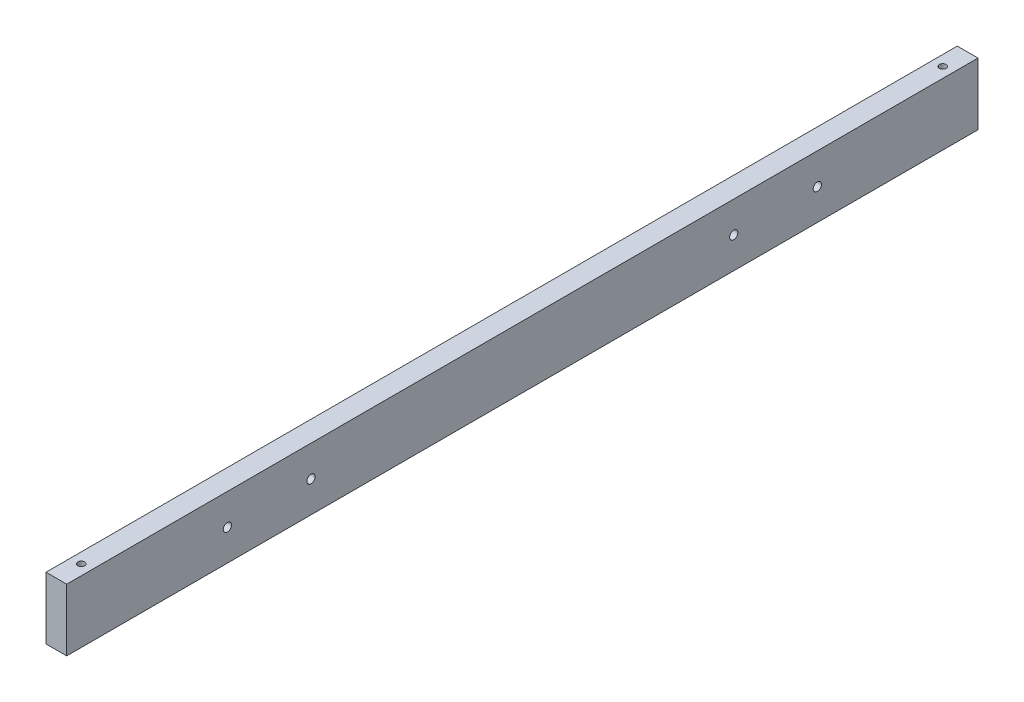
ISO-10303-21;
HEADER;
FILE_DESCRIPTION(('STEP AP214'),'2;1');
FILE_NAME('part.step','',(''),(''),'','','');
FILE_SCHEMA(('AUTOMOTIVE_DESIGN { 1 0 10303 214 1 1 1 1 }'));
ENDSEC;
DATA;
#1=APPLICATION_CONTEXT('core data for automotive mechanical design processes');
#2=APPLICATION_PROTOCOL_DEFINITION('international standard','automotive_design',2000,#1);
#3=PRODUCT_CONTEXT('',#1,'mechanical');
#4=PRODUCT('Part','Part','',(#3));
#5=PRODUCT_RELATED_PRODUCT_CATEGORY('part','',(#4));
#6=PRODUCT_DEFINITION_FORMATION('','',#4);
#7=PRODUCT_DEFINITION_CONTEXT('part definition',#1,'design');
#8=PRODUCT_DEFINITION('design','',#6,#7);
#9=PRODUCT_DEFINITION_SHAPE('','',#8);
#10=(LENGTH_UNIT() NAMED_UNIT(*) SI_UNIT(.MILLI.,.METRE.));
#11=(NAMED_UNIT(*) PLANE_ANGLE_UNIT() SI_UNIT($,.RADIAN.));
#12=(NAMED_UNIT(*) SI_UNIT($,.STERADIAN.) SOLID_ANGLE_UNIT());
#13=UNCERTAINTY_MEASURE_WITH_UNIT(LENGTH_MEASURE(1.E-05),#10,'distance_accuracy_value','');
#14=(GEOMETRIC_REPRESENTATION_CONTEXT(3) GLOBAL_UNCERTAINTY_ASSIGNED_CONTEXT((#13)) GLOBAL_UNIT_ASSIGNED_CONTEXT((#10,
#11,#12)) REPRESENTATION_CONTEXT('',''));
#15=CARTESIAN_POINT('',(0.,0.,0.));
#16=DIRECTION('',(0.,0.,1.));
#17=DIRECTION('',(1.,0.,0.));
#18=AXIS2_PLACEMENT_3D('',#15,#16,#17);
#19=CARTESIAN_POINT('',(0.,0.,440.));
#20=DIRECTION('',(1.,0.,0.));
#21=DIRECTION('',(0.,0.,-1.));
#22=AXIS2_PLACEMENT_3D('',#19,#20,#21);
#23=PLANE('',#22);
#24=CARTESIAN_POINT('',(0.,15.,362.425));
#25=DIRECTION('',(1.,0.,0.));
#26=DIRECTION('',(0.,0.,-1.));
#27=AXIS2_PLACEMENT_3D('',#24,#25,#26);
#28=CIRCLE('',#27,2.);
#29=CARTESIAN_POINT('',(0.,15.,360.425));
#30=VERTEX_POINT('',#29);
#31=EDGE_CURVE('E114',#30,#30,#28,.T.);
#32=ORIENTED_EDGE('',*,*,#31,.T.);
#33=EDGE_LOOP('',(#32));
#34=FACE_BOUND('',#33,.T.);
#35=CARTESIAN_POINT('',(0.,15.,117.96));
#36=DIRECTION('',(1.,0.,0.));
#37=DIRECTION('',(0.,0.,-1.));
#38=AXIS2_PLACEMENT_3D('',#35,#36,#37);
#39=CIRCLE('',#38,2.);
#40=CARTESIAN_POINT('',(0.,15.,115.96));
#41=VERTEX_POINT('',#40);
#42=EDGE_CURVE('E126',#41,#41,#39,.T.);
#43=ORIENTED_EDGE('',*,*,#42,.T.);
#44=EDGE_LOOP('',(#43));
#45=FACE_BOUND('',#44,.T.);
#46=CARTESIAN_POINT('',(0.,15.,322.04));
#47=DIRECTION('',(1.,0.,0.));
#48=DIRECTION('',(0.,0.,-1.));
#49=AXIS2_PLACEMENT_3D('',#46,#47,#48);
#50=CIRCLE('',#49,2.);
#51=CARTESIAN_POINT('',(0.,15.,320.04));
#52=VERTEX_POINT('',#51);
#53=EDGE_CURVE('E125',#52,#52,#50,.T.);
#54=ORIENTED_EDGE('',*,*,#53,.T.);
#55=EDGE_LOOP('',(#54));
#56=FACE_BOUND('',#55,.T.);
#57=CARTESIAN_POINT('',(0.,15.,77.575));
#58=DIRECTION('',(1.,0.,0.));
#59=DIRECTION('',(0.,0.,-1.));
#60=AXIS2_PLACEMENT_3D('',#57,#58,#59);
#61=CIRCLE('',#60,2.);
#62=CARTESIAN_POINT('',(0.,15.,75.575));
#63=VERTEX_POINT('',#62);
#64=EDGE_CURVE('E132',#63,#63,#61,.T.);
#65=ORIENTED_EDGE('',*,*,#64,.T.);
#66=EDGE_LOOP('',(#65));
#67=FACE_BOUND('',#66,.T.);
#68=DIRECTION('',(0.,-1.,0.));
#69=VECTOR('',#68,1.);
#70=CARTESIAN_POINT('',(0.,0.,0.));
#71=LINE('',#70,#69);
#72=CARTESIAN_POINT('',(0.,30.,0.));
#73=VERTEX_POINT('',#72);
#74=CARTESIAN_POINT('',(0.,0.,0.));
#75=VERTEX_POINT('',#74);
#76=EDGE_CURVE('E96',#73,#75,#71,.T.);
#77=ORIENTED_EDGE('',*,*,#76,.T.);
#78=DIRECTION('',(0.,0.,-1.));
#79=VECTOR('',#78,1.);
#80=CARTESIAN_POINT('',(0.,0.,440.));
#81=LINE('',#80,#79);
#82=CARTESIAN_POINT('',(0.,0.,440.));
#83=VERTEX_POINT('',#82);
#84=EDGE_CURVE('E11',#83,#75,#81,.T.);
#85=ORIENTED_EDGE('',*,*,#84,.F.);
#86=DIRECTION('',(0.,-1.,0.));
#87=VECTOR('',#86,1.);
#88=CARTESIAN_POINT('',(0.,0.,440.));
#89=LINE('',#88,#87);
#90=CARTESIAN_POINT('',(0.,30.,440.));
#91=VERTEX_POINT('',#90);
#92=EDGE_CURVE('E84',#91,#83,#89,.T.);
#93=ORIENTED_EDGE('',*,*,#92,.F.);
#94=DIRECTION('',(0.,0.,-1.));
#95=VECTOR('',#94,1.);
#96=CARTESIAN_POINT('',(0.,30.,440.));
#97=LINE('',#96,#95);
#98=EDGE_CURVE('E92',#91,#73,#97,.T.);
#99=ORIENTED_EDGE('',*,*,#98,.T.);
#100=EDGE_LOOP('',(#77,#85,#93,#99));
#101=FACE_BOUND('',#100,.T.);
#102=ADVANCED_FACE('F33',(#34,#45,#56,#67,#101),#23,.F.);
#103=CARTESIAN_POINT('',(0.,0.,440.));
#104=DIRECTION('',(0.,1.,0.));
#105=DIRECTION('',(0.,0.,1.));
#106=AXIS2_PLACEMENT_3D('',#103,#104,#105);
#107=PLANE('',#106);
#108=CARTESIAN_POINT('',(5.,0.,428.));
#109=DIRECTION('',(0.,1.,0.));
#110=DIRECTION('',(0.,0.,1.));
#111=AXIS2_PLACEMENT_3D('',#108,#109,#110);
#112=CIRCLE('',#111,1.65000000000002);
#113=CARTESIAN_POINT('',(5.,0.,429.65));
#114=VERTEX_POINT('',#113);
#115=EDGE_CURVE('E99',#114,#114,#112,.T.);
#116=ORIENTED_EDGE('',*,*,#115,.T.);
#117=EDGE_LOOP('',(#116));
#118=FACE_BOUND('',#117,.T.);
#119=CARTESIAN_POINT('',(4.99999999999994,0.,12.));
#120=DIRECTION('',(0.,1.,0.));
#121=DIRECTION('',(0.,0.,1.));
#122=AXIS2_PLACEMENT_3D('',#119,#120,#121);
#123=CIRCLE('',#122,1.65);
#124=CARTESIAN_POINT('',(4.99999999999994,0.,13.65));
#125=VERTEX_POINT('',#124);
#126=EDGE_CURVE('E113',#125,#125,#123,.T.);
#127=ORIENTED_EDGE('',*,*,#126,.T.);
#128=EDGE_LOOP('',(#127));
#129=FACE_BOUND('',#128,.T.);
#130=DIRECTION('',(1.,0.,0.));
#131=VECTOR('',#130,1.);
#132=CARTESIAN_POINT('',(0.,0.,0.));
#133=LINE('',#132,#131);
#134=CARTESIAN_POINT('',(10.,0.,0.));
#135=VERTEX_POINT('',#134);
#136=EDGE_CURVE('E88',#75,#135,#133,.T.);
#137=ORIENTED_EDGE('',*,*,#136,.T.);
#138=DIRECTION('',(0.,0.,-1.));
#139=VECTOR('',#138,1.);
#140=CARTESIAN_POINT('',(10.,0.,440.));
#141=LINE('',#140,#139);
#142=CARTESIAN_POINT('',(10.,0.,440.));
#143=VERTEX_POINT('',#142);
#144=EDGE_CURVE('E41',#143,#135,#141,.T.);
#145=ORIENTED_EDGE('',*,*,#144,.F.);
#146=DIRECTION('',(1.,0.,0.));
#147=VECTOR('',#146,1.);
#148=CARTESIAN_POINT('',(0.,0.,440.));
#149=LINE('',#148,#147);
#150=EDGE_CURVE('E79',#83,#143,#149,.T.);
#151=ORIENTED_EDGE('',*,*,#150,.F.);
#152=ORIENTED_EDGE('',*,*,#84,.T.);
#153=EDGE_LOOP('',(#137,#145,#151,#152));
#154=FACE_BOUND('',#153,.T.);
#155=ADVANCED_FACE('F87',(#118,#129,#154),#107,.F.);
#156=CARTESIAN_POINT('',(10.,0.,440.));
#157=DIRECTION('',(-1.,0.,0.));
#158=DIRECTION('',(0.,-1.,0.));
#159=AXIS2_PLACEMENT_3D('',#156,#157,#158);
#160=PLANE('',#159);
#161=CARTESIAN_POINT('',(10.,15.,362.425));
#162=DIRECTION('',(1.,0.,0.));
#163=DIRECTION('',(0.,0.,-1.));
#164=AXIS2_PLACEMENT_3D('',#161,#162,#163);
#165=CIRCLE('',#164,2.);
#166=CARTESIAN_POINT('',(10.,15.,360.425));
#167=VERTEX_POINT('',#166);
#168=EDGE_CURVE('E135',#167,#167,#165,.T.);
#169=ORIENTED_EDGE('',*,*,#168,.F.);
#170=EDGE_LOOP('',(#169));
#171=FACE_BOUND('',#170,.T.);
#172=CARTESIAN_POINT('',(10.,15.,117.96));
#173=DIRECTION('',(1.,0.,0.));
#174=DIRECTION('',(0.,0.,-1.));
#175=AXIS2_PLACEMENT_3D('',#172,#173,#174);
#176=CIRCLE('',#175,2.);
#177=CARTESIAN_POINT('',(10.,15.,115.96));
#178=VERTEX_POINT('',#177);
#179=EDGE_CURVE('E136',#178,#178,#176,.T.);
#180=ORIENTED_EDGE('',*,*,#179,.F.);
#181=EDGE_LOOP('',(#180));
#182=FACE_BOUND('',#181,.T.);
#183=CARTESIAN_POINT('',(10.,15.,322.04));
#184=DIRECTION('',(1.,0.,0.));
#185=DIRECTION('',(0.,0.,-1.));
#186=AXIS2_PLACEMENT_3D('',#183,#184,#185);
#187=CIRCLE('',#186,2.);
#188=CARTESIAN_POINT('',(10.,15.,320.04));
#189=VERTEX_POINT('',#188);
#190=EDGE_CURVE('E122',#189,#189,#187,.T.);
#191=ORIENTED_EDGE('',*,*,#190,.F.);
#192=EDGE_LOOP('',(#191));
#193=FACE_BOUND('',#192,.T.);
#194=CARTESIAN_POINT('',(10.,15.,77.575));
#195=DIRECTION('',(1.,0.,0.));
#196=DIRECTION('',(0.,0.,-1.));
#197=AXIS2_PLACEMENT_3D('',#194,#195,#196);
#198=CIRCLE('',#197,2.);
#199=CARTESIAN_POINT('',(10.,15.,75.575));
#200=VERTEX_POINT('',#199);
#201=EDGE_CURVE('E129',#200,#200,#198,.T.);
#202=ORIENTED_EDGE('',*,*,#201,.F.);
#203=EDGE_LOOP('',(#202));
#204=FACE_BOUND('',#203,.T.);
#205=DIRECTION('',(0.,1.,0.));
#206=VECTOR('',#205,1.);
#207=CARTESIAN_POINT('',(10.,0.,0.));
#208=LINE('',#207,#206);
#209=CARTESIAN_POINT('',(10.,30.,0.));
#210=VERTEX_POINT('',#209);
#211=EDGE_CURVE('E66',#135,#210,#208,.T.);
#212=ORIENTED_EDGE('',*,*,#211,.T.);
#213=DIRECTION('',(0.,0.,-1.));
#214=VECTOR('',#213,1.);
#215=CARTESIAN_POINT('',(10.,30.,440.));
#216=LINE('',#215,#214);
#217=CARTESIAN_POINT('',(10.,30.,440.));
#218=VERTEX_POINT('',#217);
#219=EDGE_CURVE('E89',#218,#210,#216,.T.);
#220=ORIENTED_EDGE('',*,*,#219,.F.);
#221=DIRECTION('',(0.,1.,0.));
#222=VECTOR('',#221,1.);
#223=CARTESIAN_POINT('',(10.,0.,440.));
#224=LINE('',#223,#222);
#225=EDGE_CURVE('E82',#143,#218,#224,.T.);
#226=ORIENTED_EDGE('',*,*,#225,.F.);
#227=ORIENTED_EDGE('',*,*,#144,.T.);
#228=EDGE_LOOP('',(#212,#220,#226,#227));
#229=FACE_BOUND('',#228,.T.);
#230=ADVANCED_FACE('F90',(#171,#182,#193,#204,#229),#160,.F.);
#231=CARTESIAN_POINT('',(0.,30.,440.));
#232=DIRECTION('',(0.,-1.,0.));
#233=DIRECTION('',(0.,0.,-1.));
#234=AXIS2_PLACEMENT_3D('',#231,#232,#233);
#235=PLANE('',#234);
#236=CARTESIAN_POINT('',(5.,30.,428.));
#237=DIRECTION('',(0.,1.,0.));
#238=DIRECTION('',(0.,0.,1.));
#239=AXIS2_PLACEMENT_3D('',#236,#237,#238);
#240=CIRCLE('',#239,1.65000000000002);
#241=CARTESIAN_POINT('',(5.,30.,429.65));
#242=VERTEX_POINT('',#241);
#243=EDGE_CURVE('E117',#242,#242,#240,.T.);
#244=ORIENTED_EDGE('',*,*,#243,.F.);
#245=EDGE_LOOP('',(#244));
#246=FACE_BOUND('',#245,.T.);
#247=CARTESIAN_POINT('',(4.99999999999994,30.,12.));
#248=DIRECTION('',(0.,1.,0.));
#249=DIRECTION('',(0.,0.,1.));
#250=AXIS2_PLACEMENT_3D('',#247,#248,#249);
#251=CIRCLE('',#250,1.65);
#252=CARTESIAN_POINT('',(4.99999999999994,30.,13.65));
#253=VERTEX_POINT('',#252);
#254=EDGE_CURVE('E110',#253,#253,#251,.T.);
#255=ORIENTED_EDGE('',*,*,#254,.F.);
#256=EDGE_LOOP('',(#255));
#257=FACE_BOUND('',#256,.T.);
#258=DIRECTION('',(-1.,0.,0.));
#259=VECTOR('',#258,1.);
#260=CARTESIAN_POINT('',(0.,30.,0.));
#261=LINE('',#260,#259);
#262=EDGE_CURVE('E72',#210,#73,#261,.T.);
#263=ORIENTED_EDGE('',*,*,#262,.T.);
#264=ORIENTED_EDGE('',*,*,#98,.F.);
#265=DIRECTION('',(-1.,0.,0.));
#266=VECTOR('',#265,1.);
#267=CARTESIAN_POINT('',(0.,30.,440.));
#268=LINE('',#267,#266);
#269=EDGE_CURVE('E49',#218,#91,#268,.T.);
#270=ORIENTED_EDGE('',*,*,#269,.F.);
#271=ORIENTED_EDGE('',*,*,#219,.T.);
#272=EDGE_LOOP('',(#263,#264,#270,#271));
#273=FACE_BOUND('',#272,.T.);
#274=ADVANCED_FACE('F104',(#246,#257,#273),#235,.F.);
#275=CARTESIAN_POINT('',(0.,0.,440.));
#276=DIRECTION('',(0.,0.,-1.));
#277=DIRECTION('',(-1.,0.,0.));
#278=AXIS2_PLACEMENT_3D('',#275,#276,#277);
#279=PLANE('',#278);
#280=ORIENTED_EDGE('',*,*,#92,.T.);
#281=ORIENTED_EDGE('',*,*,#150,.T.);
#282=ORIENTED_EDGE('',*,*,#225,.T.);
#283=ORIENTED_EDGE('',*,*,#269,.T.);
#284=EDGE_LOOP('',(#280,#281,#282,#283));
#285=FACE_BOUND('',#284,.T.);
#286=ADVANCED_FACE('F80',(#285),#279,.F.);
#287=CARTESIAN_POINT('',(0.,0.,0.));
#288=DIRECTION('',(0.,0.,-1.));
#289=DIRECTION('',(-1.,0.,0.));
#290=AXIS2_PLACEMENT_3D('',#287,#288,#289);
#291=PLANE('',#290);
#292=ORIENTED_EDGE('',*,*,#76,.F.);
#293=ORIENTED_EDGE('',*,*,#262,.F.);
#294=ORIENTED_EDGE('',*,*,#211,.F.);
#295=ORIENTED_EDGE('',*,*,#136,.F.);
#296=EDGE_LOOP('',(#292,#293,#294,#295));
#297=FACE_BOUND('',#296,.T.);
#298=ADVANCED_FACE('F107',(#297),#291,.T.);
#299=CARTESIAN_POINT('',(4.99999999999994,0.,12.));
#300=DIRECTION('',(0.,1.,0.));
#301=DIRECTION('',(0.,0.,1.));
#302=AXIS2_PLACEMENT_3D('',#299,#300,#301);
#303=CYLINDRICAL_SURFACE('',#302,1.65);
#304=ORIENTED_EDGE('',*,*,#126,.F.);
#305=EDGE_LOOP('',(#304));
#306=FACE_BOUND('',#305,.T.);
#307=ORIENTED_EDGE('',*,*,#254,.T.);
#308=EDGE_LOOP('',(#307));
#309=FACE_BOUND('',#308,.T.);
#310=ADVANCED_FACE('F176',(#306,#309),#303,.F.);
#311=CARTESIAN_POINT('',(5.,0.,428.));
#312=DIRECTION('',(0.,1.,0.));
#313=DIRECTION('',(0.,0.,1.));
#314=AXIS2_PLACEMENT_3D('',#311,#312,#313);
#315=CYLINDRICAL_SURFACE('',#314,1.65000000000002);
#316=ORIENTED_EDGE('',*,*,#115,.F.);
#317=EDGE_LOOP('',(#316));
#318=FACE_BOUND('',#317,.T.);
#319=ORIENTED_EDGE('',*,*,#243,.T.);
#320=EDGE_LOOP('',(#319));
#321=FACE_BOUND('',#320,.T.);
#322=ADVANCED_FACE('F167',(#318,#321),#315,.F.);
#323=CARTESIAN_POINT('',(0.,15.,77.575));
#324=DIRECTION('',(1.,0.,0.));
#325=DIRECTION('',(0.,0.,-1.));
#326=AXIS2_PLACEMENT_3D('',#323,#324,#325);
#327=CYLINDRICAL_SURFACE('',#326,2.);
#328=ORIENTED_EDGE('',*,*,#64,.F.);
#329=EDGE_LOOP('',(#328));
#330=FACE_BOUND('',#329,.T.);
#331=ORIENTED_EDGE('',*,*,#201,.T.);
#332=EDGE_LOOP('',(#331));
#333=FACE_BOUND('',#332,.T.);
#334=ADVANCED_FACE('F164',(#330,#333),#327,.F.);
#335=CARTESIAN_POINT('',(0.,15.,322.04));
#336=DIRECTION('',(1.,0.,0.));
#337=DIRECTION('',(0.,0.,-1.));
#338=AXIS2_PLACEMENT_3D('',#335,#336,#337);
#339=CYLINDRICAL_SURFACE('',#338,2.);
#340=ORIENTED_EDGE('',*,*,#53,.F.);
#341=EDGE_LOOP('',(#340));
#342=FACE_BOUND('',#341,.T.);
#343=ORIENTED_EDGE('',*,*,#190,.T.);
#344=EDGE_LOOP('',(#343));
#345=FACE_BOUND('',#344,.T.);
#346=ADVANCED_FACE('F166',(#342,#345),#339,.F.);
#347=CARTESIAN_POINT('',(0.,15.,117.96));
#348=DIRECTION('',(1.,0.,0.));
#349=DIRECTION('',(0.,0.,-1.));
#350=AXIS2_PLACEMENT_3D('',#347,#348,#349);
#351=CYLINDRICAL_SURFACE('',#350,2.);
#352=ORIENTED_EDGE('',*,*,#42,.F.);
#353=EDGE_LOOP('',(#352));
#354=FACE_BOUND('',#353,.T.);
#355=ORIENTED_EDGE('',*,*,#179,.T.);
#356=EDGE_LOOP('',(#355));
#357=FACE_BOUND('',#356,.T.);
#358=ADVANCED_FACE('F151',(#354,#357),#351,.F.);
#359=CARTESIAN_POINT('',(0.,15.,362.425));
#360=DIRECTION('',(1.,0.,0.));
#361=DIRECTION('',(0.,0.,-1.));
#362=AXIS2_PLACEMENT_3D('',#359,#360,#361);
#363=CYLINDRICAL_SURFACE('',#362,2.);
#364=ORIENTED_EDGE('',*,*,#31,.F.);
#365=EDGE_LOOP('',(#364));
#366=FACE_BOUND('',#365,.T.);
#367=ORIENTED_EDGE('',*,*,#168,.T.);
#368=EDGE_LOOP('',(#367));
#369=FACE_BOUND('',#368,.T.);
#370=ADVANCED_FACE('F148',(#366,#369),#363,.F.);
#371=CLOSED_SHELL('',(#102,#155,#230,#274,#286,#298,#310,#322,#334,#346,#358,#370));
#372=MANIFOLD_SOLID_BREP('B2',#371);
#373=ADVANCED_BREP_SHAPE_REPRESENTATION('',(#18,#372),#14);
#374=SHAPE_DEFINITION_REPRESENTATION(#9,#373);
ENDSEC;
END-ISO-10303-21;
